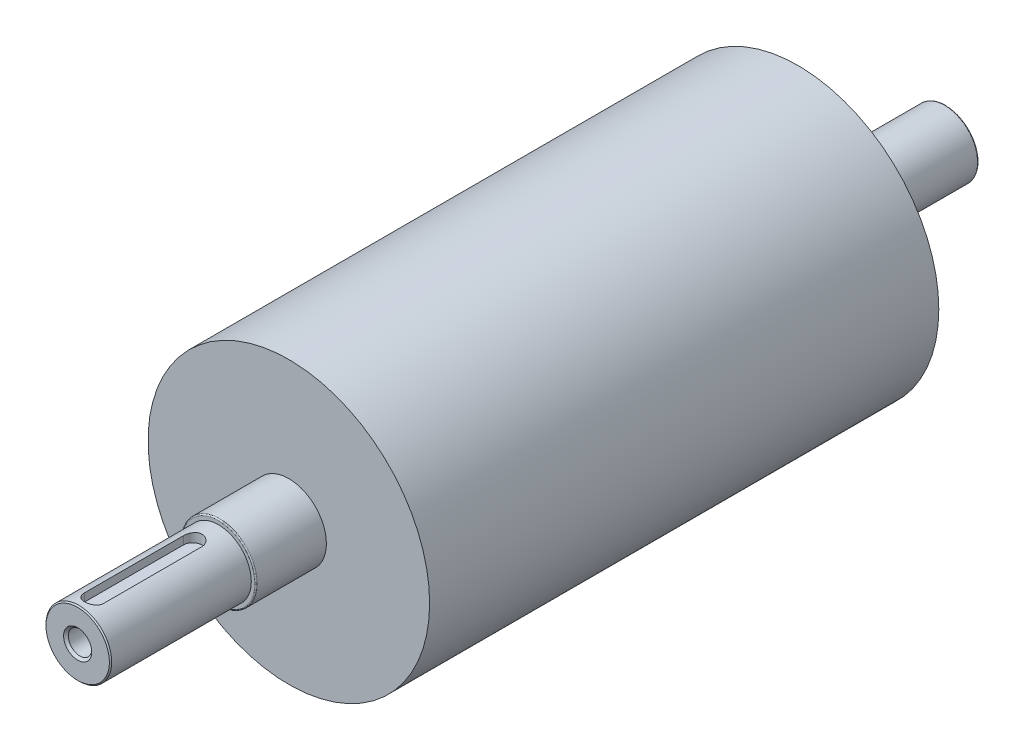
ISO-10303-21;
HEADER;
FILE_DESCRIPTION(('STEP AP214'),'2;1');
FILE_NAME('part.step','',(''),(''),'','','');
FILE_SCHEMA(('AUTOMOTIVE_DESIGN { 1 0 10303 214 1 1 1 1 }'));
ENDSEC;
DATA;
#1=APPLICATION_CONTEXT('core data for automotive mechanical design processes');
#2=APPLICATION_PROTOCOL_DEFINITION('international standard','automotive_design',2000,#1);
#3=PRODUCT_CONTEXT('',#1,'mechanical');
#4=PRODUCT('Part','Part','',(#3));
#5=PRODUCT_RELATED_PRODUCT_CATEGORY('part','',(#4));
#6=PRODUCT_DEFINITION_FORMATION('','',#4);
#7=PRODUCT_DEFINITION_CONTEXT('part definition',#1,'design');
#8=PRODUCT_DEFINITION('design','',#6,#7);
#9=PRODUCT_DEFINITION_SHAPE('','',#8);
#10=(LENGTH_UNIT() NAMED_UNIT(*) SI_UNIT(.MILLI.,.METRE.));
#11=(NAMED_UNIT(*) PLANE_ANGLE_UNIT() SI_UNIT($,.RADIAN.));
#12=(NAMED_UNIT(*) SI_UNIT($,.STERADIAN.) SOLID_ANGLE_UNIT());
#13=UNCERTAINTY_MEASURE_WITH_UNIT(LENGTH_MEASURE(1.E-05),#10,'distance_accuracy_value','');
#14=(GEOMETRIC_REPRESENTATION_CONTEXT(3) GLOBAL_UNCERTAINTY_ASSIGNED_CONTEXT((#13)) GLOBAL_UNIT_ASSIGNED_CONTEXT((#10,
#11,#12)) REPRESENTATION_CONTEXT('',''));
#15=CARTESIAN_POINT('',(0.,0.,0.));
#16=DIRECTION('',(0.,0.,1.));
#17=DIRECTION('',(1.,0.,0.));
#18=AXIS2_PLACEMENT_3D('',#15,#16,#17);
#19=CARTESIAN_POINT('',(0.,0.,95.));
#20=DIRECTION('',(0.,0.,1.));
#21=DIRECTION('',(1.,0.,0.));
#22=AXIS2_PLACEMENT_3D('',#19,#20,#21);
#23=PLANE('',#22);
#24=CARTESIAN_POINT('',(0.,0.,95.));
#25=DIRECTION('',(0.,0.,1.));
#26=DIRECTION('',(1.,0.,0.));
#27=AXIS2_PLACEMENT_3D('',#24,#25,#26);
#28=CIRCLE('',#27,5.);
#29=CARTESIAN_POINT('',(5.,0.,95.));
#30=VERTEX_POINT('',#29);
#31=EDGE_CURVE('E292',#30,#30,#28,.T.);
#32=ORIENTED_EDGE('',*,*,#31,.T.);
#33=EDGE_LOOP('',(#32));
#34=FACE_BOUND('',#33,.T.);
#35=ADVANCED_FACE('F17',(#34),#23,.T.);
#36=CARTESIAN_POINT('',(0.,0.,95.));
#37=DIRECTION('',(0.,0.,1.));
#38=DIRECTION('',(1.,0.,0.));
#39=AXIS2_PLACEMENT_3D('',#36,#37,#38);
#40=CYLINDRICAL_SURFACE('',#39,5.);
#41=CARTESIAN_POINT('',(0.,0.,128.999999999962));
#42=DIRECTION('',(0.,0.,1.));
#43=DIRECTION('',(1.,0.,0.));
#44=AXIS2_PLACEMENT_3D('',#41,#42,#43);
#45=CIRCLE('',#44,4.99999999999545);
#46=CARTESIAN_POINT('',(4.99999999999545,0.,128.999999999962));
#47=VERTEX_POINT('',#46);
#48=EDGE_CURVE('E290',#47,#47,#45,.T.);
#49=ORIENTED_EDGE('',*,*,#48,.T.);
#50=EDGE_LOOP('',(#49));
#51=FACE_BOUND('',#50,.T.);
#52=ORIENTED_EDGE('',*,*,#31,.F.);
#53=EDGE_LOOP('',(#52));
#54=FACE_BOUND('',#53,.T.);
#55=ADVANCED_FACE('F321',(#51,#54),#40,.F.);
#56=CARTESIAN_POINT('',(0.,0.,129.999999999882));
#57=DIRECTION('',(0.,0.,1.));
#58=DIRECTION('',(1.,0.,0.));
#59=AXIS2_PLACEMENT_3D('',#56,#57,#58);
#60=CONICAL_SURFACE('',#59,5.99999999991496,0.785398163397448);
#61=CARTESIAN_POINT('',(0.,0.,129.999999999939));
#62=DIRECTION('',(0.,0.,1.));
#63=DIRECTION('',(1.,0.,0.));
#64=AXIS2_PLACEMENT_3D('',#61,#62,#63);
#65=CIRCLE('',#64,5.99999999997181);
#66=CARTESIAN_POINT('',(5.99999999997181,0.,129.999999999939));
#67=VERTEX_POINT('',#66);
#68=EDGE_CURVE('E88',#67,#67,#65,.T.);
#69=ORIENTED_EDGE('',*,*,#68,.T.);
#70=EDGE_LOOP('',(#69));
#71=FACE_BOUND('',#70,.T.);
#72=ORIENTED_EDGE('',*,*,#48,.F.);
#73=EDGE_LOOP('',(#72));
#74=FACE_BOUND('',#73,.T.);
#75=ADVANCED_FACE('F318',(#71,#74),#60,.F.);
#76=CARTESIAN_POINT('',(0.,10.,123.));
#77=DIRECTION('',(0.,1.,0.));
#78=DIRECTION('',(0.,0.,1.));
#79=AXIS2_PLACEMENT_3D('',#76,#77,#78);
#80=PLANE('',#79);
#81=CARTESIAN_POINT('',(0.,10.,81.));
#82=DIRECTION('',(0.,1.,0.));
#83=DIRECTION('',(0.,0.,1.));
#84=AXIS2_PLACEMENT_3D('',#81,#82,#83);
#85=CIRCLE('',#84,4.);
#86=CARTESIAN_POINT('',(4.,10.,81.));
#87=VERTEX_POINT('',#86);
#88=CARTESIAN_POINT('',(-4.,10.,81.));
#89=VERTEX_POINT('',#88);
#90=EDGE_CURVE('E164',#87,#89,#85,.T.);
#91=ORIENTED_EDGE('',*,*,#90,.T.);
#92=DIRECTION('',(0.,0.,1.));
#93=VECTOR('',#92,1.);
#94=CARTESIAN_POINT('',(-4.,10.,123.));
#95=LINE('',#94,#93);
#96=CARTESIAN_POINT('',(-4.,10.,123.));
#97=VERTEX_POINT('',#96);
#98=EDGE_CURVE('E69',#89,#97,#95,.T.);
#99=ORIENTED_EDGE('',*,*,#98,.T.);
#100=CARTESIAN_POINT('',(0.,10.,123.));
#101=DIRECTION('',(0.,1.,0.));
#102=DIRECTION('',(0.,0.,1.));
#103=AXIS2_PLACEMENT_3D('',#100,#101,#102);
#104=CIRCLE('',#103,4.);
#105=CARTESIAN_POINT('',(4.,10.,123.));
#106=VERTEX_POINT('',#105);
#107=EDGE_CURVE('E71',#97,#106,#104,.T.);
#108=ORIENTED_EDGE('',*,*,#107,.T.);
#109=DIRECTION('',(0.,0.,-1.));
#110=VECTOR('',#109,1.);
#111=CARTESIAN_POINT('',(4.,10.,123.));
#112=LINE('',#111,#110);
#113=EDGE_CURVE('E74',#106,#87,#112,.T.);
#114=ORIENTED_EDGE('',*,*,#113,.T.);
#115=EDGE_LOOP('',(#91,#99,#108,#114));
#116=FACE_BOUND('',#115,.T.);
#117=ADVANCED_FACE('F73',(#116),#80,.T.);
#118=CARTESIAN_POINT('',(0.,0.,130.));
#119=DIRECTION('',(0.,0.,-1.));
#120=DIRECTION('',(-1.,0.,0.));
#121=AXIS2_PLACEMENT_3D('',#118,#119,#120);
#122=PLANE('',#121);
#123=CARTESIAN_POINT('',(0.,0.,130.));
#124=DIRECTION('',(0.,0.,-1.));
#125=DIRECTION('',(-1.,0.,0.));
#126=AXIS2_PLACEMENT_3D('',#123,#124,#125);
#127=CIRCLE('',#126,13.5);
#128=CARTESIAN_POINT('',(-13.5,0.,130.));
#129=VERTEX_POINT('',#128);
#130=EDGE_CURVE('E163',#129,#129,#127,.T.);
#131=ORIENTED_EDGE('',*,*,#130,.F.);
#132=EDGE_LOOP('',(#131));
#133=FACE_BOUND('',#132,.T.);
#134=ORIENTED_EDGE('',*,*,#68,.F.);
#135=EDGE_LOOP('',(#134));
#136=FACE_BOUND('',#135,.T.);
#137=ADVANCED_FACE('F118',(#133,#136),#122,.F.);
#138=CARTESIAN_POINT('',(0.,14.,-240.));
#139=DIRECTION('',(0.,0.,1.));
#140=DIRECTION('',(1.,0.,0.));
#141=AXIS2_PLACEMENT_3D('',#138,#139,#140);
#142=PLANE('',#141);
#143=CARTESIAN_POINT('',(0.,0.,-240.));
#144=DIRECTION('',(0.,0.,1.));
#145=DIRECTION('',(1.,0.,0.));
#146=AXIS2_PLACEMENT_3D('',#143,#144,#145);
#147=CIRCLE('',#146,13.5);
#148=CARTESIAN_POINT('',(13.5,0.,-240.));
#149=VERTEX_POINT('',#148);
#150=CARTESIAN_POINT('',(-13.5,0.,-240.));
#151=VERTEX_POINT('',#150);
#152=EDGE_CURVE('E101',#149,#151,#147,.T.);
#153=ORIENTED_EDGE('',*,*,#152,.F.);
#154=CARTESIAN_POINT('',(0.,0.,-240.));
#155=DIRECTION('',(0.,0.,1.));
#156=DIRECTION('',(-1.,0.,0.));
#157=AXIS2_PLACEMENT_3D('',#154,#155,#156);
#158=CIRCLE('',#157,13.5);
#159=EDGE_CURVE('E309',#151,#149,#158,.T.);
#160=ORIENTED_EDGE('',*,*,#159,.F.);
#161=EDGE_LOOP('',(#153,#160));
#162=FACE_BOUND('',#161,.T.);
#163=ADVANCED_FACE('F108',(#162),#142,.F.);
#164=CARTESIAN_POINT('',(4.,10.,123.));
#165=DIRECTION('',(1.,0.,0.));
#166=DIRECTION('',(0.,0.,-1.));
#167=AXIS2_PLACEMENT_3D('',#164,#165,#166);
#168=PLANE('',#167);
#169=ORIENTED_EDGE('',*,*,#113,.F.);
#170=DIRECTION('',(0.,1.,0.));
#171=VECTOR('',#170,1.);
#172=CARTESIAN_POINT('',(4.,10.,123.));
#173=LINE('',#172,#171);
#174=CARTESIAN_POINT('',(4.,13.4164078649987,123.));
#175=VERTEX_POINT('',#174);
#176=EDGE_CURVE('E79',#106,#175,#173,.T.);
#177=ORIENTED_EDGE('',*,*,#176,.T.);
#178=DIRECTION('',(0.,0.,1.));
#179=VECTOR('',#178,1.);
#180=CARTESIAN_POINT('',(4.,13.4164078649987,173.736045737118));
#181=LINE('',#180,#179);
#182=CARTESIAN_POINT('',(4.,13.4164078649987,81.));
#183=VERTEX_POINT('',#182);
#184=EDGE_CURVE('E176',#183,#175,#181,.T.);
#185=ORIENTED_EDGE('',*,*,#184,.F.);
#186=DIRECTION('',(0.,1.,0.));
#187=VECTOR('',#186,1.);
#188=CARTESIAN_POINT('',(4.,10.,81.));
#189=LINE('',#188,#187);
#190=EDGE_CURVE('E86',#183,#87,#189,.F.);
#191=ORIENTED_EDGE('',*,*,#190,.T.);
#192=EDGE_LOOP('',(#169,#177,#185,#191));
#193=FACE_BOUND('',#192,.T.);
#194=ADVANCED_FACE('F83',(#193),#168,.F.);
#195=CARTESIAN_POINT('',(0.,10.,123.));
#196=DIRECTION('',(0.,1.,0.));
#197=DIRECTION('',(0.,0.,1.));
#198=AXIS2_PLACEMENT_3D('',#195,#196,#197);
#199=CYLINDRICAL_SURFACE('',#198,4.);
#200=ORIENTED_EDGE('',*,*,#107,.F.);
#201=DIRECTION('',(0.,1.,0.));
#202=VECTOR('',#201,1.);
#203=CARTESIAN_POINT('',(-4.,10.,123.));
#204=LINE('',#203,#202);
#205=CARTESIAN_POINT('',(-4.,13.4164078649987,123.));
#206=VERTEX_POINT('',#205);
#207=EDGE_CURVE('E96',#97,#206,#204,.T.);
#208=ORIENTED_EDGE('',*,*,#207,.T.);
#209=CARTESIAN_POINT('',(4.,13.4164078649987,123.));
#210=CARTESIAN_POINT('',(4.00001343490374,13.4163934344135,123.110036926675));
#211=CARTESIAN_POINT('',(3.99545969395665,13.4177612654323,123.220065436688));
#212=CARTESIAN_POINT('',(3.97732232561533,13.4231542720612,123.439287943807));
#213=CARTESIAN_POINT('',(3.96374057063097,13.4271788966512,123.548482109207));
#214=CARTESIAN_POINT('',(3.92769416197871,13.437765881841,123.765008628214));
#215=CARTESIAN_POINT('',(3.90525055620323,13.4443222285088,123.872344768825));
#216=CARTESIAN_POINT('',(3.85169717339557,13.4597622556012,124.084632982969));
#217=CARTESIAN_POINT('',(3.82058720320907,13.4686459878979,124.189585003311));
#218=CARTESIAN_POINT('',(3.71462608224405,13.4984075360636,124.499721026344));
#219=CARTESIAN_POINT('',(3.62710099991691,13.5224090552225,124.700438971727));
#220=CARTESIAN_POINT('',(3.42098935669714,13.5760119738985,125.084322896469));
#221=CARTESIAN_POINT('',(3.30239120683048,13.6056154615724,125.267482292327));
#222=CARTESIAN_POINT('',(3.03386840695931,13.6680316056226,125.616352643498));
#223=CARTESIAN_POINT('',(2.8832164090277,13.7009072242617,125.781493570851));
#224=CARTESIAN_POINT('',(2.556382425271,13.7656317738932,126.084575345794));
#225=CARTESIAN_POINT('',(2.38019140382293,13.7974803366209,126.222506525717));
#226=CARTESIAN_POINT('',(2.0032006737391,13.8572821024591,126.469719696709));
#227=CARTESIAN_POINT('',(1.80199712493941,13.8851498305851,126.578407786917));
#228=CARTESIAN_POINT('',(1.38337268849406,13.9330711702936,126.760081117458));
#229=CARTESIAN_POINT('',(1.16597179435832,13.9531342313746,126.83310956023));
#230=CARTESIAN_POINT('',(0.789610797235763,13.9785727200676,126.924503414198));
#231=CARTESIAN_POINT('',(0.633158576321086,13.9865650377927,126.952762172256));
#232=CARTESIAN_POINT('',(0.317825012693669,13.9972808418301,126.990513613817));
#233=CARTESIAN_POINT('',(0.158943740702079,14.0000044812451,127.000006842628));
#234=CARTESIAN_POINT('',(-0.219804916507733,13.9999938028405,126.99999053726));
#235=CARTESIAN_POINT('',(-0.439729300710904,13.9947702370882,126.981812752613));
#236=CARTESIAN_POINT('',(-0.873281891254478,13.974427138593,126.909701788191));
#237=CARTESIAN_POINT('',(-1.08690416753906,13.9592985776616,126.855735987837));
#238=CARTESIAN_POINT('',(-1.50141421461743,13.9208127565694,126.713980525576));
#239=CARTESIAN_POINT('',(-1.70232199721598,13.8974688271089,126.626245637733));
#240=CARTESIAN_POINT('',(-2.08655402005816,13.8449971507054,126.419633904712));
#241=CARTESIAN_POINT('',(-2.26987791297923,13.8158692895512,126.30075644457));
#242=CARTESIAN_POINT('',(-2.61858413232396,13.7540954836222,126.031933767916));
#243=CARTESIAN_POINT('',(-2.78343881874553,13.7213825649603,125.881319539723));
#244=CARTESIAN_POINT('',(-3.08593606855292,13.6565362468944,125.554711957194));
#245=CARTESIAN_POINT('',(-3.22357317920481,13.6244029647833,125.378713529608));
#246=CARTESIAN_POINT('',(-3.47043423258746,13.5636509104045,125.001958274609));
#247=CARTESIAN_POINT('',(-3.57902155119103,13.5351171665143,124.800769765836));
#248=CARTESIAN_POINT('',(-3.76055335195927,13.4858125018546,124.382096927033));
#249=CARTESIAN_POINT('',(-3.83352792414043,13.4650350311361,124.16462653378));
#250=CARTESIAN_POINT('',(-3.92473752344851,13.438674544498,123.788382908948));
#251=CARTESIAN_POINT('',(-3.95290660945642,13.430383420026,123.632137598001));
#252=CARTESIAN_POINT('',(-3.99055500781452,13.4192239844835,123.317292479956));
#253=CARTESIAN_POINT('',(-4.0000422591046,13.4163533699612,123.158693701857));
#254=CARTESIAN_POINT('',(-4.,13.4164078649987,123.));
#255=B_SPLINE_CURVE_WITH_KNOTS('',3,(#209,#210,#211,#212,#213,#214,#215,#216,#217,#218,#219,
#220,#221,#222,#223,#224,#225,#226,#227,#228,#229,#230,#231,#232,#233,#234,#235,#236,#237,#238,
#239,#240,#241,#242,#243,#244,#245,#246,#247,#248,#249,#250,#251,#252,#253,#254),.UNSPECIFIED.,
.F.,.F.,(4,2,2,2,2,2,2,2,2,2,2,2,2,2,2,2,2,2,2,2,2,2,4),(0.,0.329993708296159,0.659918997251084,
0.989065345152732,1.31821902959364,1.9757624411703,2.63355143930765,3.30826099223925,
3.98320984050179,4.67097819826485,5.35791122946818,5.83432815874191,6.31073124358389,
6.9695539177274,7.62897793204117,8.2873368258276,8.94570872105026,9.61967052217997,
10.29376720746,10.981609847748,11.668870303633,12.1446689970502,12.6202654537409),.UNSPECIFIED.);
#256=EDGE_CURVE('E92',#175,#206,#255,.T.);
#257=ORIENTED_EDGE('',*,*,#256,.F.);
#258=ORIENTED_EDGE('',*,*,#176,.F.);
#259=EDGE_LOOP('',(#200,#208,#257,#258));
#260=FACE_BOUND('',#259,.T.);
#261=ADVANCED_FACE('F90',(#260),#199,.F.);
#262=CARTESIAN_POINT('',(-4.,10.,123.));
#263=DIRECTION('',(-1.,0.,0.));
#264=DIRECTION('',(0.,0.,1.));
#265=AXIS2_PLACEMENT_3D('',#262,#263,#264);
#266=PLANE('',#265);
#267=ORIENTED_EDGE('',*,*,#98,.F.);
#268=DIRECTION('',(0.,1.,0.));
#269=VECTOR('',#268,1.);
#270=CARTESIAN_POINT('',(-4.,10.,81.));
#271=LINE('',#270,#269);
#272=CARTESIAN_POINT('',(-4.,13.4164078649987,81.));
#273=VERTEX_POINT('',#272);
#274=EDGE_CURVE('E162',#89,#273,#271,.T.);
#275=ORIENTED_EDGE('',*,*,#274,.T.);
#276=DIRECTION('',(0.,0.,1.));
#277=VECTOR('',#276,1.);
#278=CARTESIAN_POINT('',(-4.,13.4164078649987,173.736045737118));
#279=LINE('',#278,#277);
#280=EDGE_CURVE('E169',#206,#273,#279,.F.);
#281=ORIENTED_EDGE('',*,*,#280,.F.);
#282=ORIENTED_EDGE('',*,*,#207,.F.);
#283=EDGE_LOOP('',(#267,#275,#281,#282));
#284=FACE_BOUND('',#283,.T.);
#285=ADVANCED_FACE('F170',(#284),#266,.F.);
#286=CARTESIAN_POINT('',(0.,10.,81.));
#287=DIRECTION('',(0.,1.,0.));
#288=DIRECTION('',(0.,0.,1.));
#289=AXIS2_PLACEMENT_3D('',#286,#287,#288);
#290=CYLINDRICAL_SURFACE('',#289,4.);
#291=ORIENTED_EDGE('',*,*,#90,.F.);
#292=ORIENTED_EDGE('',*,*,#190,.F.);
#293=CARTESIAN_POINT('',(-4.,13.4164078649987,81.));
#294=CARTESIAN_POINT('',(-4.00001343424814,13.4163934343768,80.8899630617349));
#295=CARTESIAN_POINT('',(-3.99545969266927,13.417761265702,80.7799345401276));
#296=CARTESIAN_POINT('',(-3.97732232121695,13.4231542734801,80.560712010627));
#297=CARTESIAN_POINT('',(-3.96374056379899,13.4271788988993,80.4515178344354));
#298=CARTESIAN_POINT('',(-3.92769415038322,13.4377658850065,80.2349913174175));
#299=CARTESIAN_POINT('',(-3.90525054417987,13.4443222312205,80.1276551892464));
#300=CARTESIAN_POINT('',(-3.8516971698999,13.4597622573638,79.9153669974456));
#301=CARTESIAN_POINT('',(-3.82058720849962,13.4686459892105,79.8104149870559));
#302=CARTESIAN_POINT('',(-3.71462722105448,13.4984072106126,79.5002823570005));
#303=CARTESIAN_POINT('',(-3.62710377190382,13.5224082651875,79.2995675996925));
#304=CARTESIAN_POINT('',(-3.42099335445293,13.5760110031023,78.9156831379329));
#305=CARTESIAN_POINT('',(-3.30239378136284,13.6056149576787,78.732520594102));
#306=CARTESIAN_POINT('',(-3.03385514387188,13.6680345915526,78.3836305951117));
#307=CARTESIAN_POINT('',(-2.88318637668458,13.7009134336833,78.2184749799399));
#308=CARTESIAN_POINT('',(-2.55635049218508,13.7656378360174,77.9153986440201));
#309=CARTESIAN_POINT('',(-2.38017915468807,13.7974832241344,77.7774824398191));
#310=CARTESIAN_POINT('',(-2.00328797864421,13.8572672913436,77.5303406116899));
#311=CARTESIAN_POINT('',(-1.80217262010785,13.885122326296,77.42169609442));
#312=CARTESIAN_POINT('',(-1.38360719231065,13.9330517158678,77.2399929964269));
#313=CARTESIAN_POINT('',(-1.16616104383813,13.9531279309862,77.1669259053991));
#314=CARTESIAN_POINT('',(-0.727119470413194,13.9827902284191,77.0603316832356));
#315=CARTESIAN_POINT('',(-0.505780313916729,13.9926363331616,77.0258226885391));
#316=CARTESIAN_POINT('',(-0.0602449633135629,14.0016419286283,76.9942264724947));
#317=CARTESIAN_POINT('',(0.163950738694264,14.0008032358133,76.9971328903689));
#318=CARTESIAN_POINT('',(0.601961495843514,13.9887201082301,77.0396128161252));
#319=CARTESIAN_POINT('',(0.815889248066123,13.9777773149303,77.0781234599459));
#320=CARTESIAN_POINT('',(1.23410663687489,13.9470775079522,77.1889911230344));
#321=CARTESIAN_POINT('',(1.43839578630406,13.9273200492871,77.2613498510487));
#322=CARTESIAN_POINT('',(1.83414901693189,13.8807804985663,77.4386188903073));
#323=CARTESIAN_POINT('',(2.02544821255193,13.8539238723959,77.5438768871685));
#324=CARTESIAN_POINT('',(2.38801825135016,13.7960546774321,77.783693736945));
#325=CARTESIAN_POINT('',(2.55928501856377,13.7650412656095,77.9182585369809));
#326=CARTESIAN_POINT('',(2.88324485398744,13.7009177251593,78.2183867969127));
#327=CARTESIAN_POINT('',(3.03507809124176,13.6677722027509,78.3848703325082));
#328=CARTESIAN_POINT('',(3.30897556854652,13.6040627781022,78.7414264428721));
#329=CARTESIAN_POINT('',(3.43103136574906,13.573499609643,78.9315056847752));
#330=CARTESIAN_POINT('',(3.58945338157003,13.5321405016799,79.2311586718983));
#331=CARTESIAN_POINT('',(3.63832313759783,13.5190503394637,79.3339898434328));
#332=CARTESIAN_POINT('',(3.72718558970199,13.4948216745023,79.5436262587176));
#333=CARTESIAN_POINT('',(3.767181890327,13.4836823796704,79.6504298681334));
#334=CARTESIAN_POINT('',(3.83791732102717,13.463719461374,79.8671386652105));
#335=CARTESIAN_POINT('',(3.86866612224974,13.4548934199316,79.9770404801988));
#336=CARTESIAN_POINT('',(3.92067829243349,13.4398293634308,80.1991959399608));
#337=CARTESIAN_POINT('',(3.9419460559715,13.4335901494402,80.3114484698354));
#338=CARTESIAN_POINT('',(3.97223001063664,13.4246640965205,80.5197322021381));
#339=CARTESIAN_POINT('',(3.98264484818434,13.4215735027143,80.6155453591243));
#340=CARTESIAN_POINT('',(3.99652828145244,13.4174428037393,80.8075697805955));
#341=CARTESIAN_POINT('',(4.00000747148811,13.4163995712304,80.903780212592));
#342=CARTESIAN_POINT('',(4.,13.4164078649987,81.));
#343=B_SPLINE_CURVE_WITH_KNOTS('',3,(#293,#294,#295,#296,#297,#298,#299,#300,#301,#302,#303,
#304,#305,#306,#307,#308,#309,#310,#311,#312,#313,#314,#315,#316,#317,#318,#319,#320,#321,#322,
#323,#324,#325,#326,#327,#328,#329,#330,#331,#332,#333,#334,#335,#336,#337,#338,#339,#340,#341,
#342),.UNSPECIFIED.,.F.,.F.,(4,2,2,2,2,2,2,2,2,2,2,2,2,2,2,2,2,2,2,2,2,2,2,2,4),(0.,
0.329993743043623,0.659919065086366,0.989065375849981,1.31821902959231,1.97575167696557,
2.6335514401874,3.30832474645299,3.98320984263717,4.67064278038706,5.35791119973408,
6.02724874934374,6.69647251025093,7.34634193868019,7.99624417788576,8.6532612048729,
9.31041168231766,9.99056134493198,10.6709036279931,11.0143588121194,11.3576742224041,
11.700629330619,12.0434253092463,12.3324405185763,12.6210139131113),.UNSPECIFIED.);
#344=EDGE_CURVE('E161',#273,#183,#343,.T.);
#345=ORIENTED_EDGE('',*,*,#344,.F.);
#346=ORIENTED_EDGE('',*,*,#274,.F.);
#347=EDGE_LOOP('',(#291,#292,#345,#346));
#348=FACE_BOUND('',#347,.T.);
#349=ADVANCED_FACE('F191',(#348),#290,.F.);
#350=CARTESIAN_POINT('',(0.,0.,129.5));
#351=DIRECTION('',(0.,0.,-1.));
#352=DIRECTION('',(-1.,0.,0.));
#353=AXIS2_PLACEMENT_3D('',#350,#351,#352);
#354=CONICAL_SURFACE('',#353,14.,0.785398163397453);
#355=CARTESIAN_POINT('',(0.,0.,129.5));
#356=DIRECTION('',(0.,0.,1.));
#357=DIRECTION('',(1.,0.,0.));
#358=AXIS2_PLACEMENT_3D('',#355,#356,#357);
#359=CIRCLE('',#358,14.);
#360=CARTESIAN_POINT('',(14.,0.,129.5));
#361=VERTEX_POINT('',#360);
#362=EDGE_CURVE('E158',#361,#361,#359,.F.);
#363=ORIENTED_EDGE('',*,*,#362,.F.);
#364=EDGE_LOOP('',(#363));
#365=FACE_BOUND('',#364,.T.);
#366=ORIENTED_EDGE('',*,*,#130,.T.);
#367=EDGE_LOOP('',(#366));
#368=FACE_BOUND('',#367,.T.);
#369=ADVANCED_FACE('F147',(#365,#368),#354,.T.);
#370=CARTESIAN_POINT('',(0.,0.,-239.5));
#371=DIRECTION('',(0.,0.,1.));
#372=DIRECTION('',(1.,0.,0.));
#373=AXIS2_PLACEMENT_3D('',#370,#371,#372);
#374=TOROIDAL_SURFACE('',#373,13.5,0.5);
#375=CARTESIAN_POINT('',(0.,0.,-239.5));
#376=DIRECTION('',(0.,0.,1.));
#377=DIRECTION('',(1.,0.,0.));
#378=AXIS2_PLACEMENT_3D('',#375,#376,#377);
#379=CIRCLE('',#378,14.);
#380=CARTESIAN_POINT('',(14.,0.,-239.5));
#381=VERTEX_POINT('',#380);
#382=EDGE_CURVE('E156',#381,#381,#379,.T.);
#383=ORIENTED_EDGE('',*,*,#382,.F.);
#384=EDGE_LOOP('',(#383));
#385=FACE_BOUND('',#384,.T.);
#386=ORIENTED_EDGE('',*,*,#152,.T.);
#387=ORIENTED_EDGE('',*,*,#159,.T.);
#388=EDGE_LOOP('',(#386,#387));
#389=FACE_BOUND('',#388,.T.);
#390=ADVANCED_FACE('F135',(#385,#389),#374,.T.);
#391=CARTESIAN_POINT('',(0.,0.,173.736045737118));
#392=DIRECTION('',(0.,0.,1.));
#393=DIRECTION('',(1.,0.,0.));
#394=AXIS2_PLACEMENT_3D('',#391,#392,#393);
#395=CYLINDRICAL_SURFACE('',#394,14.);
#396=ORIENTED_EDGE('',*,*,#362,.T.);
#397=EDGE_LOOP('',(#396));
#398=FACE_BOUND('',#397,.T.);
#399=CARTESIAN_POINT('',(0.,0.,70.));
#400=DIRECTION('',(0.,0.,1.));
#401=DIRECTION('',(1.,0.,0.));
#402=AXIS2_PLACEMENT_3D('',#399,#400,#401);
#403=CIRCLE('',#402,14.);
#404=CARTESIAN_POINT('',(14.,0.,70.));
#405=VERTEX_POINT('',#404);
#406=EDGE_CURVE('E276',#405,#405,#403,.T.);
#407=ORIENTED_EDGE('',*,*,#406,.T.);
#408=EDGE_LOOP('',(#407));
#409=FACE_BOUND('',#408,.T.);
#410=ORIENTED_EDGE('',*,*,#280,.T.);
#411=ORIENTED_EDGE('',*,*,#344,.T.);
#412=ORIENTED_EDGE('',*,*,#184,.T.);
#413=ORIENTED_EDGE('',*,*,#256,.T.);
#414=EDGE_LOOP('',(#410,#411,#412,#413));
#415=FACE_BOUND('',#414,.T.);
#416=ADVANCED_FACE('F146',(#398,#409,#415),#395,.T.);
#417=CARTESIAN_POINT('',(0.,0.,173.736045737118));
#418=DIRECTION('',(0.,0.,1.));
#419=DIRECTION('',(1.,0.,0.));
#420=AXIS2_PLACEMENT_3D('',#417,#418,#419);
#421=CYLINDRICAL_SURFACE('',#420,14.);
#422=CARTESIAN_POINT('',(0.,0.,-205.));
#423=DIRECTION('',(0.,0.,1.));
#424=DIRECTION('',(1.,0.,0.));
#425=AXIS2_PLACEMENT_3D('',#422,#423,#424);
#426=CIRCLE('',#425,14.);
#427=CARTESIAN_POINT('',(14.,0.,-205.));
#428=VERTEX_POINT('',#427);
#429=EDGE_CURVE('E274',#428,#428,#426,.F.);
#430=ORIENTED_EDGE('',*,*,#429,.T.);
#431=EDGE_LOOP('',(#430));
#432=FACE_BOUND('',#431,.T.);
#433=ORIENTED_EDGE('',*,*,#382,.T.);
#434=EDGE_LOOP('',(#433));
#435=FACE_BOUND('',#434,.T.);
#436=ADVANCED_FACE('F251',(#432,#435),#421,.T.);
#437=CARTESIAN_POINT('',(0.,14.,70.));
#438=DIRECTION('',(0.,0.,-1.));
#439=DIRECTION('',(-1.,0.,0.));
#440=AXIS2_PLACEMENT_3D('',#437,#438,#439);
#441=PLANE('',#440);
#442=ORIENTED_EDGE('',*,*,#406,.F.);
#443=EDGE_LOOP('',(#442));
#444=FACE_BOUND('',#443,.T.);
#445=CARTESIAN_POINT('',(0.,0.,70.));
#446=DIRECTION('',(0.,0.,-1.));
#447=DIRECTION('',(-1.,0.,0.));
#448=AXIS2_PLACEMENT_3D('',#445,#446,#447);
#449=CIRCLE('',#448,15.5);
#450=CARTESIAN_POINT('',(-15.5,0.,70.));
#451=VERTEX_POINT('',#450);
#452=CARTESIAN_POINT('',(15.5,0.,70.));
#453=VERTEX_POINT('',#452);
#454=EDGE_CURVE('E239',#451,#453,#449,.T.);
#455=ORIENTED_EDGE('',*,*,#454,.F.);
#456=CARTESIAN_POINT('',(0.,0.,70.));
#457=DIRECTION('',(0.,0.,-1.));
#458=DIRECTION('',(1.,0.,0.));
#459=AXIS2_PLACEMENT_3D('',#456,#457,#458);
#460=CIRCLE('',#459,15.5);
#461=EDGE_CURVE('E36',#453,#451,#460,.T.);
#462=ORIENTED_EDGE('',*,*,#461,.F.);
#463=EDGE_LOOP('',(#455,#462));
#464=FACE_BOUND('',#463,.T.);
#465=ADVANCED_FACE('F243',(#444,#464),#441,.F.);
#466=CARTESIAN_POINT('',(0.,16.,-205.));
#467=DIRECTION('',(0.,0.,1.));
#468=DIRECTION('',(1.,0.,0.));
#469=AXIS2_PLACEMENT_3D('',#466,#467,#468);
#470=PLANE('',#469);
#471=ORIENTED_EDGE('',*,*,#429,.F.);
#472=EDGE_LOOP('',(#471));
#473=FACE_BOUND('',#472,.T.);
#474=CARTESIAN_POINT('',(0.,0.,-205.));
#475=DIRECTION('',(0.,0.,1.));
#476=DIRECTION('',(1.,0.,0.));
#477=AXIS2_PLACEMENT_3D('',#474,#475,#476);
#478=CIRCLE('',#477,16.);
#479=CARTESIAN_POINT('',(16.,0.,-205.));
#480=VERTEX_POINT('',#479);
#481=EDGE_CURVE('E271',#480,#480,#478,.T.);
#482=ORIENTED_EDGE('',*,*,#481,.F.);
#483=EDGE_LOOP('',(#482));
#484=FACE_BOUND('',#483,.T.);
#485=ADVANCED_FACE('F229',(#473,#484),#470,.F.);
#486=CARTESIAN_POINT('',(0.,0.,69.5));
#487=DIRECTION('',(0.,0.,-1.));
#488=DIRECTION('',(-1.,0.,0.));
#489=AXIS2_PLACEMENT_3D('',#486,#487,#488);
#490=TOROIDAL_SURFACE('',#489,15.5,0.5);
#491=CARTESIAN_POINT('',(0.,0.,69.5));
#492=DIRECTION('',(0.,0.,1.));
#493=DIRECTION('',(1.,0.,0.));
#494=AXIS2_PLACEMENT_3D('',#491,#492,#493);
#495=CIRCLE('',#494,16.);
#496=CARTESIAN_POINT('',(16.,0.,69.5));
#497=VERTEX_POINT('',#496);
#498=EDGE_CURVE('E237',#497,#497,#495,.F.);
#499=ORIENTED_EDGE('',*,*,#498,.F.);
#500=EDGE_LOOP('',(#499));
#501=FACE_BOUND('',#500,.T.);
#502=ORIENTED_EDGE('',*,*,#454,.T.);
#503=ORIENTED_EDGE('',*,*,#461,.T.);
#504=EDGE_LOOP('',(#502,#503));
#505=FACE_BOUND('',#504,.T.);
#506=ADVANCED_FACE('F223',(#501,#505),#490,.T.);
#507=CARTESIAN_POINT('',(0.,0.,173.736045737118));
#508=DIRECTION('',(0.,0.,1.));
#509=DIRECTION('',(1.,0.,0.));
#510=AXIS2_PLACEMENT_3D('',#507,#508,#509);
#511=CYLINDRICAL_SURFACE('',#510,16.);
#512=CARTESIAN_POINT('',(0.,0.,-177.));
#513=DIRECTION('',(0.,0.,1.));
#514=DIRECTION('',(1.,0.,0.));
#515=AXIS2_PLACEMENT_3D('',#512,#513,#514);
#516=CIRCLE('',#515,16.);
#517=CARTESIAN_POINT('',(16.,0.,-177.));
#518=VERTEX_POINT('',#517);
#519=EDGE_CURVE('E282',#518,#518,#516,.F.);
#520=ORIENTED_EDGE('',*,*,#519,.T.);
#521=EDGE_LOOP('',(#520));
#522=FACE_BOUND('',#521,.T.);
#523=ORIENTED_EDGE('',*,*,#481,.T.);
#524=EDGE_LOOP('',(#523));
#525=FACE_BOUND('',#524,.T.);
#526=ADVANCED_FACE('F219',(#522,#525),#511,.T.);
#527=CARTESIAN_POINT('',(0.,0.,173.736045737118));
#528=DIRECTION('',(0.,0.,1.));
#529=DIRECTION('',(1.,0.,0.));
#530=AXIS2_PLACEMENT_3D('',#527,#528,#529);
#531=CYLINDRICAL_SURFACE('',#530,16.);
#532=ORIENTED_EDGE('',*,*,#498,.T.);
#533=EDGE_LOOP('',(#532));
#534=FACE_BOUND('',#533,.T.);
#535=CARTESIAN_POINT('',(0.,0.,40.));
#536=DIRECTION('',(0.,0.,1.));
#537=DIRECTION('',(1.,0.,0.));
#538=AXIS2_PLACEMENT_3D('',#535,#536,#537);
#539=CIRCLE('',#538,16.);
#540=CARTESIAN_POINT('',(16.,0.,40.));
#541=VERTEX_POINT('',#540);
#542=EDGE_CURVE('E285',#541,#541,#539,.T.);
#543=ORIENTED_EDGE('',*,*,#542,.T.);
#544=EDGE_LOOP('',(#543));
#545=FACE_BOUND('',#544,.T.);
#546=ADVANCED_FACE('F215',(#534,#545),#531,.T.);
#547=CARTESIAN_POINT('',(0.,60.,-177.));
#548=DIRECTION('',(0.,0.,1.));
#549=DIRECTION('',(1.,0.,0.));
#550=AXIS2_PLACEMENT_3D('',#547,#548,#549);
#551=PLANE('',#550);
#552=ORIENTED_EDGE('',*,*,#519,.F.);
#553=EDGE_LOOP('',(#552));
#554=FACE_BOUND('',#553,.T.);
#555=CARTESIAN_POINT('',(0.,0.,-177.));
#556=DIRECTION('',(0.,0.,1.));
#557=DIRECTION('',(1.,0.,0.));
#558=AXIS2_PLACEMENT_3D('',#555,#556,#557);
#559=CIRCLE('',#558,60.);
#560=CARTESIAN_POINT('',(60.,0.,-177.));
#561=VERTEX_POINT('',#560);
#562=EDGE_CURVE('E28',#561,#561,#559,.T.);
#563=ORIENTED_EDGE('',*,*,#562,.F.);
#564=EDGE_LOOP('',(#563));
#565=FACE_BOUND('',#564,.T.);
#566=ADVANCED_FACE('F208',(#554,#565),#551,.F.);
#567=CARTESIAN_POINT('',(0.,16.,40.));
#568=DIRECTION('',(0.,0.,-1.));
#569=DIRECTION('',(-1.,0.,0.));
#570=AXIS2_PLACEMENT_3D('',#567,#568,#569);
#571=PLANE('',#570);
#572=CARTESIAN_POINT('',(0.,0.,40.));
#573=DIRECTION('',(0.,0.,1.));
#574=DIRECTION('',(1.,0.,0.));
#575=AXIS2_PLACEMENT_3D('',#572,#573,#574);
#576=CIRCLE('',#575,60.);
#577=CARTESIAN_POINT('',(60.,0.,40.));
#578=VERTEX_POINT('',#577);
#579=EDGE_CURVE('E11',#578,#578,#576,.F.);
#580=ORIENTED_EDGE('',*,*,#579,.F.);
#581=EDGE_LOOP('',(#580));
#582=FACE_BOUND('',#581,.T.);
#583=ORIENTED_EDGE('',*,*,#542,.F.);
#584=EDGE_LOOP('',(#583));
#585=FACE_BOUND('',#584,.T.);
#586=ADVANCED_FACE('F202',(#582,#585),#571,.F.);
#587=CARTESIAN_POINT('',(0.,0.,173.736045737118));
#588=DIRECTION('',(0.,0.,1.));
#589=DIRECTION('',(1.,0.,0.));
#590=AXIS2_PLACEMENT_3D('',#587,#588,#589);
#591=CYLINDRICAL_SURFACE('',#590,60.);
#592=ORIENTED_EDGE('',*,*,#579,.T.);
#593=EDGE_LOOP('',(#592));
#594=FACE_BOUND('',#593,.T.);
#595=ORIENTED_EDGE('',*,*,#562,.T.);
#596=EDGE_LOOP('',(#595));
#597=FACE_BOUND('',#596,.T.);
#598=ADVANCED_FACE('F200',(#594,#597),#591,.T.);
#599=CLOSED_SHELL('',(#35,#55,#75,#117,#137,#163,#194,#261,#285,#349,#369,#390,#416,#436,#465,
#485,#506,#526,#546,#566,#586,#598));
#600=MANIFOLD_SOLID_BREP('B1',#599);
#601=ADVANCED_BREP_SHAPE_REPRESENTATION('',(#18,#600),#14);
#602=SHAPE_DEFINITION_REPRESENTATION(#9,#601);
ENDSEC;
END-ISO-10303-21;
